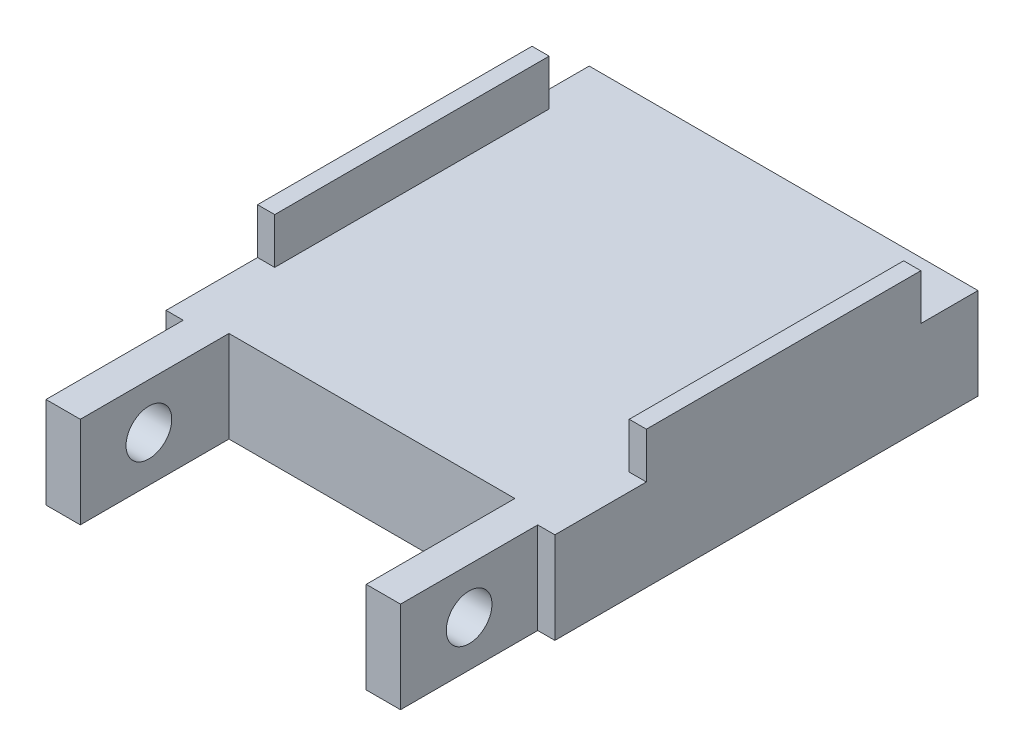
ISO-10303-21;
HEADER;
FILE_DESCRIPTION(('STEP AP214'),'2;1');
FILE_NAME('part.step','',(''),(''),'','','');
FILE_SCHEMA(('AUTOMOTIVE_DESIGN { 1 0 10303 214 1 1 1 1 }'));
ENDSEC;
DATA;
#1=APPLICATION_CONTEXT('core data for automotive mechanical design processes');
#2=APPLICATION_PROTOCOL_DEFINITION('international standard','automotive_design',2000,#1);
#3=PRODUCT_CONTEXT('',#1,'mechanical');
#4=PRODUCT('Part','Part','',(#3));
#5=PRODUCT_RELATED_PRODUCT_CATEGORY('part','',(#4));
#6=PRODUCT_DEFINITION_FORMATION('','',#4);
#7=PRODUCT_DEFINITION_CONTEXT('part definition',#1,'design');
#8=PRODUCT_DEFINITION('design','',#6,#7);
#9=PRODUCT_DEFINITION_SHAPE('','',#8);
#10=(LENGTH_UNIT() NAMED_UNIT(*) SI_UNIT(.MILLI.,.METRE.));
#11=(NAMED_UNIT(*) PLANE_ANGLE_UNIT() SI_UNIT($,.RADIAN.));
#12=(NAMED_UNIT(*) SI_UNIT($,.STERADIAN.) SOLID_ANGLE_UNIT());
#13=UNCERTAINTY_MEASURE_WITH_UNIT(LENGTH_MEASURE(1.E-05),#10,'distance_accuracy_value','');
#14=(GEOMETRIC_REPRESENTATION_CONTEXT(3) GLOBAL_UNCERTAINTY_ASSIGNED_CONTEXT((#13)) GLOBAL_UNIT_ASSIGNED_CONTEXT((#10,
#11,#12)) REPRESENTATION_CONTEXT('',''));
#15=CARTESIAN_POINT('',(0.,0.,0.));
#16=DIRECTION('',(0.,0.,1.));
#17=DIRECTION('',(1.,0.,0.));
#18=AXIS2_PLACEMENT_3D('',#15,#16,#17);
#19=CARTESIAN_POINT('',(17.,8.,24.5));
#20=DIRECTION('',(0.,0.,-1.));
#21=DIRECTION('',(-1.,0.,0.));
#22=AXIS2_PLACEMENT_3D('',#19,#20,#21);
#23=PLANE('',#22);
#24=DIRECTION('',(1.,0.,0.));
#25=VECTOR('',#24,1.);
#26=CARTESIAN_POINT('',(17.,8.,24.5));
#27=LINE('',#26,#25);
#28=CARTESIAN_POINT('',(-15.5,8.,24.5));
#29=VERTEX_POINT('',#28);
#30=CARTESIAN_POINT('',(-12.5,8.,24.5));
#31=VERTEX_POINT('',#30);
#32=EDGE_CURVE('E193',#29,#31,#27,.T.);
#33=ORIENTED_EDGE('',*,*,#32,.F.);
#34=DIRECTION('',(0.,1.,0.));
#35=VECTOR('',#34,1.);
#36=CARTESIAN_POINT('',(-15.5,-28.1780056072107,24.5));
#37=LINE('',#36,#35);
#38=CARTESIAN_POINT('',(-15.5,0.,24.5));
#39=VERTEX_POINT('',#38);
#40=EDGE_CURVE('E175',#39,#29,#37,.T.);
#41=ORIENTED_EDGE('',*,*,#40,.F.);
#42=DIRECTION('',(1.,0.,0.));
#43=VECTOR('',#42,1.);
#44=CARTESIAN_POINT('',(17.,0.,24.5));
#45=LINE('',#44,#43);
#46=CARTESIAN_POINT('',(-12.5,0.,24.5));
#47=VERTEX_POINT('',#46);
#48=EDGE_CURVE('E226',#39,#47,#45,.T.);
#49=ORIENTED_EDGE('',*,*,#48,.T.);
#50=DIRECTION('',(0.,1.,0.));
#51=VECTOR('',#50,1.);
#52=CARTESIAN_POINT('',(-12.5,-28.1780056072107,24.5));
#53=LINE('',#52,#51);
#54=EDGE_CURVE('E199',#47,#31,#53,.T.);
#55=ORIENTED_EDGE('',*,*,#54,.T.);
#56=EDGE_LOOP('',(#33,#41,#49,#55));
#57=FACE_BOUND('',#56,.T.);
#58=ADVANCED_FACE('F39',(#57),#23,.F.);
#59=CARTESIAN_POINT('',(0.,8.,0.));
#60=DIRECTION('',(0.,1.,0.));
#61=DIRECTION('',(0.,0.,1.));
#62=AXIS2_PLACEMENT_3D('',#59,#60,#61);
#63=PLANE('',#62);
#64=DIRECTION('',(0.,0.,1.));
#65=VECTOR('',#64,1.);
#66=CARTESIAN_POINT('',(-12.5,8.,24.5));
#67=LINE('',#66,#65);
#68=CARTESIAN_POINT('',(-12.5,8.,11.5));
#69=VERTEX_POINT('',#68);
#70=EDGE_CURVE('E298',#69,#31,#67,.T.);
#71=ORIENTED_EDGE('',*,*,#70,.F.);
#72=DIRECTION('',(-1.,0.,0.));
#73=VECTOR('',#72,1.);
#74=CARTESIAN_POINT('',(-12.5,8.,11.5));
#75=LINE('',#74,#73);
#76=CARTESIAN_POINT('',(12.5,8.,11.5));
#77=VERTEX_POINT('',#76);
#78=EDGE_CURVE('E306',#77,#69,#75,.T.);
#79=ORIENTED_EDGE('',*,*,#78,.F.);
#80=DIRECTION('',(0.,0.,-1.));
#81=VECTOR('',#80,1.);
#82=CARTESIAN_POINT('',(12.5,8.,24.5));
#83=LINE('',#82,#81);
#84=CARTESIAN_POINT('',(12.5,8.,24.5));
#85=VERTEX_POINT('',#84);
#86=EDGE_CURVE('E301',#85,#77,#83,.T.);
#87=ORIENTED_EDGE('',*,*,#86,.F.);
#88=CARTESIAN_POINT('',(15.5,8.,24.5));
#89=VERTEX_POINT('',#88);
#90=EDGE_CURVE('E202',#85,#89,#27,.T.);
#91=ORIENTED_EDGE('',*,*,#90,.T.);
#92=DIRECTION('',(0.,0.,1.));
#93=VECTOR('',#92,1.);
#94=CARTESIAN_POINT('',(15.5,8.,24.5));
#95=LINE('',#94,#93);
#96=CARTESIAN_POINT('',(15.5,8.,12.5));
#97=VERTEX_POINT('',#96);
#98=EDGE_CURVE('E275',#97,#89,#95,.T.);
#99=ORIENTED_EDGE('',*,*,#98,.F.);
#100=DIRECTION('',(-1.,0.,0.));
#101=VECTOR('',#100,1.);
#102=CARTESIAN_POINT('',(17.,8.,12.5));
#103=LINE('',#102,#101);
#104=CARTESIAN_POINT('',(17.,8.,12.5));
#105=VERTEX_POINT('',#104);
#106=EDGE_CURVE('E272',#105,#97,#103,.T.);
#107=ORIENTED_EDGE('',*,*,#106,.F.);
#108=DIRECTION('',(0.,0.,-1.));
#109=VECTOR('',#108,1.);
#110=CARTESIAN_POINT('',(17.,8.,24.5));
#111=LINE('',#110,#109);
#112=CARTESIAN_POINT('',(17.,8.,4.5));
#113=VERTEX_POINT('',#112);
#114=EDGE_CURVE('E206',#105,#113,#111,.T.);
#115=ORIENTED_EDGE('',*,*,#114,.T.);
#116=DIRECTION('',(1.,0.,0.));
#117=VECTOR('',#116,1.);
#118=CARTESIAN_POINT('',(17.,8.,4.5));
#119=LINE('',#118,#117);
#120=CARTESIAN_POINT('',(15.5,8.,4.5));
#121=VERTEX_POINT('',#120);
#122=EDGE_CURVE('E325',#121,#113,#119,.T.);
#123=ORIENTED_EDGE('',*,*,#122,.F.);
#124=DIRECTION('',(0.,0.,1.));
#125=VECTOR('',#124,1.);
#126=CARTESIAN_POINT('',(15.5,8.,-19.5));
#127=LINE('',#126,#125);
#128=CARTESIAN_POINT('',(15.5,8.,-19.5));
#129=VERTEX_POINT('',#128);
#130=EDGE_CURVE('E256',#129,#121,#127,.T.);
#131=ORIENTED_EDGE('',*,*,#130,.F.);
#132=DIRECTION('',(-1.,0.,0.));
#133=VECTOR('',#132,1.);
#134=CARTESIAN_POINT('',(17.,8.,-19.5));
#135=LINE('',#134,#133);
#136=CARTESIAN_POINT('',(17.,8.,-19.5));
#137=VERTEX_POINT('',#136);
#138=EDGE_CURVE('E252',#137,#129,#135,.T.);
#139=ORIENTED_EDGE('',*,*,#138,.F.);
#140=CARTESIAN_POINT('',(17.,8.,-24.5));
#141=VERTEX_POINT('',#140);
#142=EDGE_CURVE('E201',#137,#141,#111,.T.);
#143=ORIENTED_EDGE('',*,*,#142,.T.);
#144=DIRECTION('',(-1.,0.,0.));
#145=VECTOR('',#144,1.);
#146=CARTESIAN_POINT('',(17.,8.,-24.5));
#147=LINE('',#146,#145);
#148=CARTESIAN_POINT('',(-17.,8.,-24.5));
#149=VERTEX_POINT('',#148);
#150=EDGE_CURVE('E214',#141,#149,#147,.T.);
#151=ORIENTED_EDGE('',*,*,#150,.T.);
#152=DIRECTION('',(0.,0.,1.));
#153=VECTOR('',#152,1.);
#154=CARTESIAN_POINT('',(-17.,8.,24.5));
#155=LINE('',#154,#153);
#156=CARTESIAN_POINT('',(-17.,8.,-19.5));
#157=VERTEX_POINT('',#156);
#158=EDGE_CURVE('E209',#149,#157,#155,.T.);
#159=ORIENTED_EDGE('',*,*,#158,.T.);
#160=DIRECTION('',(-1.,0.,0.));
#161=VECTOR('',#160,1.);
#162=CARTESIAN_POINT('',(-17.,8.,-19.5));
#163=LINE('',#162,#161);
#164=CARTESIAN_POINT('',(-15.5,8.,-19.5));
#165=VERTEX_POINT('',#164);
#166=EDGE_CURVE('E360',#165,#157,#163,.T.);
#167=ORIENTED_EDGE('',*,*,#166,.F.);
#168=DIRECTION('',(0.,0.,-1.));
#169=VECTOR('',#168,1.);
#170=CARTESIAN_POINT('',(-15.5,8.,-19.5));
#171=LINE('',#170,#169);
#172=CARTESIAN_POINT('',(-15.5,8.,4.5));
#173=VERTEX_POINT('',#172);
#174=EDGE_CURVE('E373',#173,#165,#171,.T.);
#175=ORIENTED_EDGE('',*,*,#174,.F.);
#176=DIRECTION('',(1.,0.,0.));
#177=VECTOR('',#176,1.);
#178=CARTESIAN_POINT('',(-17.,8.,4.5));
#179=LINE('',#178,#177);
#180=CARTESIAN_POINT('',(-17.,8.,4.5));
#181=VERTEX_POINT('',#180);
#182=EDGE_CURVE('E354',#181,#173,#179,.T.);
#183=ORIENTED_EDGE('',*,*,#182,.F.);
#184=CARTESIAN_POINT('',(-17.,8.,12.5));
#185=VERTEX_POINT('',#184);
#186=EDGE_CURVE('E232',#181,#185,#155,.T.);
#187=ORIENTED_EDGE('',*,*,#186,.T.);
#188=DIRECTION('',(-1.,0.,0.));
#189=VECTOR('',#188,1.);
#190=CARTESIAN_POINT('',(-17.,8.,12.5));
#191=LINE('',#190,#189);
#192=CARTESIAN_POINT('',(-15.5,8.,12.5));
#193=VERTEX_POINT('',#192);
#194=EDGE_CURVE('E187',#193,#185,#191,.T.);
#195=ORIENTED_EDGE('',*,*,#194,.F.);
#196=DIRECTION('',(0.,0.,-1.));
#197=VECTOR('',#196,1.);
#198=CARTESIAN_POINT('',(-15.5,8.,24.5));
#199=LINE('',#198,#197);
#200=EDGE_CURVE('E178',#29,#193,#199,.T.);
#201=ORIENTED_EDGE('',*,*,#200,.F.);
#202=ORIENTED_EDGE('',*,*,#32,.T.);
#203=EDGE_LOOP('',(#71,#79,#87,#91,#99,#107,#115,#123,#131,#139,#143,#151,#159,#167,#175,#183,
#187,#195,#201,#202));
#204=FACE_BOUND('',#203,.T.);
#205=ADVANCED_FACE('F192',(#204),#63,.T.);
#206=CARTESIAN_POINT('',(-17.,8.,24.5));
#207=DIRECTION('',(1.,0.,0.));
#208=DIRECTION('',(0.,0.,-1.));
#209=AXIS2_PLACEMENT_3D('',#206,#207,#208);
#210=PLANE('',#209);
#211=DIRECTION('',(0.,0.,1.));
#212=VECTOR('',#211,1.);
#213=CARTESIAN_POINT('',(-17.,0.,24.5));
#214=LINE('',#213,#212);
#215=CARTESIAN_POINT('',(-17.,0.,-24.5));
#216=VERTEX_POINT('',#215);
#217=CARTESIAN_POINT('',(-17.,0.,12.5));
#218=VERTEX_POINT('',#217);
#219=EDGE_CURVE('E217',#216,#218,#214,.T.);
#220=ORIENTED_EDGE('',*,*,#219,.T.);
#221=DIRECTION('',(0.,1.,0.));
#222=VECTOR('',#221,1.);
#223=CARTESIAN_POINT('',(-17.,-28.1780056072107,12.5));
#224=LINE('',#223,#222);
#225=EDGE_CURVE('E258',#218,#185,#224,.T.);
#226=ORIENTED_EDGE('',*,*,#225,.T.);
#227=ORIENTED_EDGE('',*,*,#186,.F.);
#228=DIRECTION('',(0.,-1.,0.));
#229=VECTOR('',#228,1.);
#230=CARTESIAN_POINT('',(-17.,12.,4.5));
#231=LINE('',#230,#229);
#232=CARTESIAN_POINT('',(-17.,12.,4.5));
#233=VERTEX_POINT('',#232);
#234=EDGE_CURVE('E222',#233,#181,#231,.T.);
#235=ORIENTED_EDGE('',*,*,#234,.F.);
#236=DIRECTION('',(0.,0.,1.));
#237=VECTOR('',#236,1.);
#238=CARTESIAN_POINT('',(-17.,12.,-19.5));
#239=LINE('',#238,#237);
#240=CARTESIAN_POINT('',(-17.,12.,-19.5));
#241=VERTEX_POINT('',#240);
#242=EDGE_CURVE('E355',#241,#233,#239,.T.);
#243=ORIENTED_EDGE('',*,*,#242,.F.);
#244=DIRECTION('',(0.,-1.,0.));
#245=VECTOR('',#244,1.);
#246=CARTESIAN_POINT('',(-17.,12.,-19.5));
#247=LINE('',#246,#245);
#248=EDGE_CURVE('E369',#241,#157,#247,.T.);
#249=ORIENTED_EDGE('',*,*,#248,.T.);
#250=ORIENTED_EDGE('',*,*,#158,.F.);
#251=DIRECTION('',(0.,-1.,0.));
#252=VECTOR('',#251,1.);
#253=CARTESIAN_POINT('',(-17.,8.,-24.5));
#254=LINE('',#253,#252);
#255=EDGE_CURVE('E48',#149,#216,#254,.T.);
#256=ORIENTED_EDGE('',*,*,#255,.T.);
#257=EDGE_LOOP('',(#220,#226,#227,#235,#243,#249,#250,#256));
#258=FACE_BOUND('',#257,.T.);
#259=ADVANCED_FACE('F41',(#258),#210,.F.);
#260=CARTESIAN_POINT('',(12.5,0.,24.5));
#261=VERTEX_POINT('',#260);
#262=CARTESIAN_POINT('',(15.5,0.,24.5));
#263=VERTEX_POINT('',#262);
#264=EDGE_CURVE('E221',#261,#263,#45,.T.);
#265=ORIENTED_EDGE('',*,*,#264,.T.);
#266=DIRECTION('',(0.,1.,0.));
#267=VECTOR('',#266,1.);
#268=CARTESIAN_POINT('',(15.5,-28.1780056072107,24.5));
#269=LINE('',#268,#267);
#270=EDGE_CURVE('E271',#263,#89,#269,.T.);
#271=ORIENTED_EDGE('',*,*,#270,.T.);
#272=ORIENTED_EDGE('',*,*,#90,.F.);
#273=DIRECTION('',(0.,1.,0.));
#274=VECTOR('',#273,1.);
#275=CARTESIAN_POINT('',(12.5,-28.1780056072107,24.5));
#276=LINE('',#275,#274);
#277=EDGE_CURVE('E315',#261,#85,#276,.T.);
#278=ORIENTED_EDGE('',*,*,#277,.F.);
#279=EDGE_LOOP('',(#265,#271,#272,#278));
#280=FACE_BOUND('',#279,.T.);
#281=ADVANCED_FACE('F421',(#280),#23,.F.);
#282=CARTESIAN_POINT('',(17.,8.,24.5));
#283=DIRECTION('',(-1.,0.,0.));
#284=DIRECTION('',(0.,0.,1.));
#285=AXIS2_PLACEMENT_3D('',#282,#283,#284);
#286=PLANE('',#285);
#287=ORIENTED_EDGE('',*,*,#114,.F.);
#288=DIRECTION('',(0.,1.,0.));
#289=VECTOR('',#288,1.);
#290=CARTESIAN_POINT('',(17.,-28.1780056072107,12.5));
#291=LINE('',#290,#289);
#292=CARTESIAN_POINT('',(17.,0.,12.5));
#293=VERTEX_POINT('',#292);
#294=EDGE_CURVE('E279',#293,#105,#291,.T.);
#295=ORIENTED_EDGE('',*,*,#294,.F.);
#296=DIRECTION('',(0.,0.,-1.));
#297=VECTOR('',#296,1.);
#298=CARTESIAN_POINT('',(17.,0.,24.5));
#299=LINE('',#298,#297);
#300=CARTESIAN_POINT('',(17.,0.,-24.5));
#301=VERTEX_POINT('',#300);
#302=EDGE_CURVE('E227',#293,#301,#299,.T.);
#303=ORIENTED_EDGE('',*,*,#302,.T.);
#304=DIRECTION('',(0.,-1.,0.));
#305=VECTOR('',#304,1.);
#306=CARTESIAN_POINT('',(17.,8.,-24.5));
#307=LINE('',#306,#305);
#308=EDGE_CURVE('E11',#141,#301,#307,.T.);
#309=ORIENTED_EDGE('',*,*,#308,.F.);
#310=ORIENTED_EDGE('',*,*,#142,.F.);
#311=DIRECTION('',(0.,-1.,0.));
#312=VECTOR('',#311,1.);
#313=CARTESIAN_POINT('',(17.,12.,-19.5));
#314=LINE('',#313,#312);
#315=CARTESIAN_POINT('',(17.,12.,-19.5));
#316=VERTEX_POINT('',#315);
#317=EDGE_CURVE('E351',#316,#137,#314,.T.);
#318=ORIENTED_EDGE('',*,*,#317,.F.);
#319=DIRECTION('',(0.,0.,-1.));
#320=VECTOR('',#319,1.);
#321=CARTESIAN_POINT('',(17.,12.,-19.5));
#322=LINE('',#321,#320);
#323=CARTESIAN_POINT('',(17.,12.,4.5));
#324=VERTEX_POINT('',#323);
#325=EDGE_CURVE('E320',#324,#316,#322,.T.);
#326=ORIENTED_EDGE('',*,*,#325,.F.);
#327=DIRECTION('',(0.,-1.,0.));
#328=VECTOR('',#327,1.);
#329=CARTESIAN_POINT('',(17.,12.,4.5));
#330=LINE('',#329,#328);
#331=EDGE_CURVE('E333',#324,#113,#330,.T.);
#332=ORIENTED_EDGE('',*,*,#331,.T.);
#333=EDGE_LOOP('',(#287,#295,#303,#309,#310,#318,#326,#332));
#334=FACE_BOUND('',#333,.T.);
#335=ADVANCED_FACE('F428',(#334),#286,.F.);
#336=CARTESIAN_POINT('',(17.,8.,-24.5));
#337=DIRECTION('',(0.,0.,1.));
#338=DIRECTION('',(1.,0.,0.));
#339=AXIS2_PLACEMENT_3D('',#336,#337,#338);
#340=PLANE('',#339);
#341=DIRECTION('',(-1.,0.,0.));
#342=VECTOR('',#341,1.);
#343=CARTESIAN_POINT('',(17.,0.,-24.5));
#344=LINE('',#343,#342);
#345=EDGE_CURVE('E230',#301,#216,#344,.T.);
#346=ORIENTED_EDGE('',*,*,#345,.T.);
#347=ORIENTED_EDGE('',*,*,#255,.F.);
#348=ORIENTED_EDGE('',*,*,#150,.F.);
#349=ORIENTED_EDGE('',*,*,#308,.T.);
#350=EDGE_LOOP('',(#346,#347,#348,#349));
#351=FACE_BOUND('',#350,.T.);
#352=ADVANCED_FACE('F434',(#351),#340,.F.);
#353=CARTESIAN_POINT('',(0.,0.,0.));
#354=DIRECTION('',(0.,1.,0.));
#355=DIRECTION('',(0.,0.,1.));
#356=AXIS2_PLACEMENT_3D('',#353,#354,#355);
#357=PLANE('',#356);
#358=CARTESIAN_POINT('',(4.99999999999999,0.,-9.49999999999999));
#359=DIRECTION('',(0.,-1.,0.));
#360=DIRECTION('',(0.,0.,-1.));
#361=AXIS2_PLACEMENT_3D('',#358,#359,#360);
#362=CIRCLE('',#361,0.500000000000002);
#363=CARTESIAN_POINT('',(4.99999999999999,0.,-10.));
#364=VERTEX_POINT('',#363);
#365=EDGE_CURVE('E816',#364,#364,#362,.T.);
#366=ORIENTED_EDGE('',*,*,#365,.F.);
#367=EDGE_LOOP('',(#366));
#368=FACE_BOUND('',#367,.T.);
#369=CARTESIAN_POINT('',(11.,0.,-9.49999999999999));
#370=DIRECTION('',(0.,-1.,0.));
#371=DIRECTION('',(0.,0.,-1.));
#372=AXIS2_PLACEMENT_3D('',#369,#370,#371);
#373=CIRCLE('',#372,0.500000000000001);
#374=CARTESIAN_POINT('',(11.,0.,-9.99999999999999));
#375=VERTEX_POINT('',#374);
#376=EDGE_CURVE('E833',#375,#375,#373,.T.);
#377=ORIENTED_EDGE('',*,*,#376,.F.);
#378=EDGE_LOOP('',(#377));
#379=FACE_BOUND('',#378,.T.);
#380=CARTESIAN_POINT('',(-4.50000000000001,0.,-9.49999999999999));
#381=DIRECTION('',(0.,-1.,0.));
#382=DIRECTION('',(0.,0.,-1.));
#383=AXIS2_PLACEMENT_3D('',#380,#381,#382);
#384=CIRCLE('',#383,0.5);
#385=CARTESIAN_POINT('',(-4.50000000000001,0.,-9.99999999999999));
#386=VERTEX_POINT('',#385);
#387=EDGE_CURVE('E841',#386,#386,#384,.T.);
#388=ORIENTED_EDGE('',*,*,#387,.F.);
#389=EDGE_LOOP('',(#388));
#390=FACE_BOUND('',#389,.T.);
#391=CARTESIAN_POINT('',(-10.5,0.,-9.49999999999999));
#392=DIRECTION('',(0.,-1.,0.));
#393=DIRECTION('',(0.,0.,-1.));
#394=AXIS2_PLACEMENT_3D('',#391,#392,#393);
#395=CIRCLE('',#394,0.500000000000001);
#396=CARTESIAN_POINT('',(-10.5,0.,-9.99999999999999));
#397=VERTEX_POINT('',#396);
#398=EDGE_CURVE('E849',#397,#397,#395,.T.);
#399=ORIENTED_EDGE('',*,*,#398,.F.);
#400=EDGE_LOOP('',(#399));
#401=FACE_BOUND('',#400,.T.);
#402=CARTESIAN_POINT('',(0.,0.,-14.));
#403=DIRECTION('',(0.,-1.,0.));
#404=DIRECTION('',(0.,0.,-1.));
#405=AXIS2_PLACEMENT_3D('',#402,#403,#404);
#406=CIRCLE('',#405,0.500000000000001);
#407=CARTESIAN_POINT('',(0.,0.,-14.5));
#408=VERTEX_POINT('',#407);
#409=EDGE_CURVE('E883',#408,#408,#406,.T.);
#410=ORIENTED_EDGE('',*,*,#409,.F.);
#411=EDGE_LOOP('',(#410));
#412=FACE_BOUND('',#411,.T.);
#413=CARTESIAN_POINT('',(0.,0.,-5.));
#414=DIRECTION('',(0.,-1.,0.));
#415=DIRECTION('',(0.,0.,-1.));
#416=AXIS2_PLACEMENT_3D('',#413,#414,#415);
#417=CIRCLE('',#416,0.5);
#418=CARTESIAN_POINT('',(0.,0.,-5.5));
#419=VERTEX_POINT('',#418);
#420=EDGE_CURVE('E827',#419,#419,#417,.T.);
#421=ORIENTED_EDGE('',*,*,#420,.F.);
#422=EDGE_LOOP('',(#421));
#423=FACE_BOUND('',#422,.T.);
#424=CARTESIAN_POINT('',(0.,0.,-9.5));
#425=DIRECTION('',(0.,-1.,0.));
#426=DIRECTION('',(0.,0.,-1.));
#427=AXIS2_PLACEMENT_3D('',#424,#425,#426);
#428=CIRCLE('',#427,1.5);
#429=CARTESIAN_POINT('',(0.,0.,-11.));
#430=VERTEX_POINT('',#429);
#431=EDGE_CURVE('E815',#430,#430,#428,.T.);
#432=ORIENTED_EDGE('',*,*,#431,.F.);
#433=EDGE_LOOP('',(#432));
#434=FACE_BOUND('',#433,.T.);
#435=DIRECTION('',(0.,0.,1.));
#436=VECTOR('',#435,1.);
#437=CARTESIAN_POINT('',(12.5,0.,24.5));
#438=LINE('',#437,#436);
#439=CARTESIAN_POINT('',(12.5,0.,11.5));
#440=VERTEX_POINT('',#439);
#441=EDGE_CURVE('E289',#440,#261,#438,.T.);
#442=ORIENTED_EDGE('',*,*,#441,.F.);
#443=DIRECTION('',(1.,0.,0.));
#444=VECTOR('',#443,1.);
#445=CARTESIAN_POINT('',(-12.5,0.,11.5));
#446=LINE('',#445,#444);
#447=CARTESIAN_POINT('',(-12.5,0.,11.5));
#448=VERTEX_POINT('',#447);
#449=EDGE_CURVE('E292',#448,#440,#446,.T.);
#450=ORIENTED_EDGE('',*,*,#449,.F.);
#451=DIRECTION('',(0.,0.,-1.));
#452=VECTOR('',#451,1.);
#453=CARTESIAN_POINT('',(-12.5,0.,24.5));
#454=LINE('',#453,#452);
#455=EDGE_CURVE('E276',#47,#448,#454,.T.);
#456=ORIENTED_EDGE('',*,*,#455,.F.);
#457=ORIENTED_EDGE('',*,*,#48,.F.);
#458=DIRECTION('',(0.,0.,1.));
#459=VECTOR('',#458,1.);
#460=CARTESIAN_POINT('',(-15.5,0.,24.5));
#461=LINE('',#460,#459);
#462=CARTESIAN_POINT('',(-15.5,0.,12.5));
#463=VERTEX_POINT('',#462);
#464=EDGE_CURVE('E181',#463,#39,#461,.T.);
#465=ORIENTED_EDGE('',*,*,#464,.F.);
#466=DIRECTION('',(1.,0.,0.));
#467=VECTOR('',#466,1.);
#468=CARTESIAN_POINT('',(-17.,0.,12.5));
#469=LINE('',#468,#467);
#470=EDGE_CURVE('E249',#218,#463,#469,.T.);
#471=ORIENTED_EDGE('',*,*,#470,.F.);
#472=ORIENTED_EDGE('',*,*,#219,.F.);
#473=ORIENTED_EDGE('',*,*,#345,.F.);
#474=ORIENTED_EDGE('',*,*,#302,.F.);
#475=DIRECTION('',(1.,0.,0.));
#476=VECTOR('',#475,1.);
#477=CARTESIAN_POINT('',(17.,0.,12.5));
#478=LINE('',#477,#476);
#479=CARTESIAN_POINT('',(15.5,0.,12.5));
#480=VERTEX_POINT('',#479);
#481=EDGE_CURVE('E196',#480,#293,#478,.T.);
#482=ORIENTED_EDGE('',*,*,#481,.F.);
#483=DIRECTION('',(0.,0.,-1.));
#484=VECTOR('',#483,1.);
#485=CARTESIAN_POINT('',(15.5,0.,24.5));
#486=LINE('',#485,#484);
#487=EDGE_CURVE('E268',#263,#480,#486,.T.);
#488=ORIENTED_EDGE('',*,*,#487,.F.);
#489=ORIENTED_EDGE('',*,*,#264,.F.);
#490=EDGE_LOOP('',(#442,#450,#456,#457,#465,#471,#472,#473,#474,#482,#488,#489));
#491=FACE_BOUND('',#490,.T.);
#492=ADVANCED_FACE('F247',(#368,#379,#390,#401,#412,#423,#434,#491),#357,.F.);
#493=CARTESIAN_POINT('',(-17.,12.,4.5));
#494=DIRECTION('',(0.,0.,-1.));
#495=DIRECTION('',(-1.,0.,0.));
#496=AXIS2_PLACEMENT_3D('',#493,#494,#495);
#497=PLANE('',#496);
#498=ORIENTED_EDGE('',*,*,#182,.T.);
#499=DIRECTION('',(0.,-1.,0.));
#500=VECTOR('',#499,1.);
#501=CARTESIAN_POINT('',(-15.5,12.,4.5));
#502=LINE('',#501,#500);
#503=CARTESIAN_POINT('',(-15.5,12.,4.5));
#504=VERTEX_POINT('',#503);
#505=EDGE_CURVE('E386',#504,#173,#502,.T.);
#506=ORIENTED_EDGE('',*,*,#505,.F.);
#507=DIRECTION('',(1.,0.,0.));
#508=VECTOR('',#507,1.);
#509=CARTESIAN_POINT('',(-17.,12.,4.5));
#510=LINE('',#509,#508);
#511=EDGE_CURVE('E359',#233,#504,#510,.T.);
#512=ORIENTED_EDGE('',*,*,#511,.F.);
#513=ORIENTED_EDGE('',*,*,#234,.T.);
#514=EDGE_LOOP('',(#498,#506,#512,#513));
#515=FACE_BOUND('',#514,.T.);
#516=ADVANCED_FACE('F393',(#515),#497,.F.);
#517=CARTESIAN_POINT('',(-15.5,12.,-19.5));
#518=DIRECTION('',(-1.,0.,0.));
#519=DIRECTION('',(0.,0.,1.));
#520=AXIS2_PLACEMENT_3D('',#517,#518,#519);
#521=PLANE('',#520);
#522=ORIENTED_EDGE('',*,*,#174,.T.);
#523=DIRECTION('',(0.,-1.,0.));
#524=VECTOR('',#523,1.);
#525=CARTESIAN_POINT('',(-15.5,12.,-19.5));
#526=LINE('',#525,#524);
#527=CARTESIAN_POINT('',(-15.5,12.,-19.5));
#528=VERTEX_POINT('',#527);
#529=EDGE_CURVE('E382',#528,#165,#526,.T.);
#530=ORIENTED_EDGE('',*,*,#529,.F.);
#531=DIRECTION('',(0.,0.,-1.));
#532=VECTOR('',#531,1.);
#533=CARTESIAN_POINT('',(-15.5,12.,-19.5));
#534=LINE('',#533,#532);
#535=EDGE_CURVE('E363',#504,#528,#534,.T.);
#536=ORIENTED_EDGE('',*,*,#535,.F.);
#537=ORIENTED_EDGE('',*,*,#505,.T.);
#538=EDGE_LOOP('',(#522,#530,#536,#537));
#539=FACE_BOUND('',#538,.T.);
#540=ADVANCED_FACE('F406',(#539),#521,.F.);
#541=CARTESIAN_POINT('',(-17.,12.,-19.5));
#542=DIRECTION('',(0.,0.,1.));
#543=DIRECTION('',(1.,0.,0.));
#544=AXIS2_PLACEMENT_3D('',#541,#542,#543);
#545=PLANE('',#544);
#546=ORIENTED_EDGE('',*,*,#166,.T.);
#547=ORIENTED_EDGE('',*,*,#248,.F.);
#548=DIRECTION('',(-1.,0.,0.));
#549=VECTOR('',#548,1.);
#550=CARTESIAN_POINT('',(-17.,12.,-19.5));
#551=LINE('',#550,#549);
#552=EDGE_CURVE('E366',#528,#241,#551,.T.);
#553=ORIENTED_EDGE('',*,*,#552,.F.);
#554=ORIENTED_EDGE('',*,*,#529,.T.);
#555=EDGE_LOOP('',(#546,#547,#553,#554));
#556=FACE_BOUND('',#555,.T.);
#557=ADVANCED_FACE('F401',(#556),#545,.F.);
#558=CARTESIAN_POINT('',(0.,12.,0.));
#559=DIRECTION('',(0.,1.,0.));
#560=DIRECTION('',(0.,0.,1.));
#561=AXIS2_PLACEMENT_3D('',#558,#559,#560);
#562=PLANE('',#561);
#563=ORIENTED_EDGE('',*,*,#242,.T.);
#564=ORIENTED_EDGE('',*,*,#511,.T.);
#565=ORIENTED_EDGE('',*,*,#535,.T.);
#566=ORIENTED_EDGE('',*,*,#552,.T.);
#567=EDGE_LOOP('',(#563,#564,#565,#566));
#568=FACE_BOUND('',#567,.T.);
#569=ADVANCED_FACE('F408',(#568),#562,.T.);
#570=CARTESIAN_POINT('',(17.,12.,-19.5));
#571=DIRECTION('',(0.,0.,1.));
#572=DIRECTION('',(1.,0.,0.));
#573=AXIS2_PLACEMENT_3D('',#570,#571,#572);
#574=PLANE('',#573);
#575=ORIENTED_EDGE('',*,*,#138,.T.);
#576=DIRECTION('',(0.,-1.,0.));
#577=VECTOR('',#576,1.);
#578=CARTESIAN_POINT('',(15.5,12.,-19.5));
#579=LINE('',#578,#577);
#580=CARTESIAN_POINT('',(15.5,12.,-19.5));
#581=VERTEX_POINT('',#580);
#582=EDGE_CURVE('E347',#581,#129,#579,.T.);
#583=ORIENTED_EDGE('',*,*,#582,.F.);
#584=DIRECTION('',(-1.,0.,0.));
#585=VECTOR('',#584,1.);
#586=CARTESIAN_POINT('',(17.,12.,-19.5));
#587=LINE('',#586,#585);
#588=EDGE_CURVE('E324',#316,#581,#587,.T.);
#589=ORIENTED_EDGE('',*,*,#588,.F.);
#590=ORIENTED_EDGE('',*,*,#317,.T.);
#591=EDGE_LOOP('',(#575,#583,#589,#590));
#592=FACE_BOUND('',#591,.T.);
#593=ADVANCED_FACE('F410',(#592),#574,.F.);
#594=CARTESIAN_POINT('',(15.5,12.,-19.5));
#595=DIRECTION('',(1.,0.,0.));
#596=DIRECTION('',(0.,0.,-1.));
#597=AXIS2_PLACEMENT_3D('',#594,#595,#596);
#598=PLANE('',#597);
#599=ORIENTED_EDGE('',*,*,#130,.T.);
#600=DIRECTION('',(0.,-1.,0.));
#601=VECTOR('',#600,1.);
#602=CARTESIAN_POINT('',(15.5,12.,4.5));
#603=LINE('',#602,#601);
#604=CARTESIAN_POINT('',(15.5,12.,4.5));
#605=VERTEX_POINT('',#604);
#606=EDGE_CURVE('E344',#605,#121,#603,.T.);
#607=ORIENTED_EDGE('',*,*,#606,.F.);
#608=DIRECTION('',(0.,0.,1.));
#609=VECTOR('',#608,1.);
#610=CARTESIAN_POINT('',(15.5,12.,-19.5));
#611=LINE('',#610,#609);
#612=EDGE_CURVE('E328',#581,#605,#611,.T.);
#613=ORIENTED_EDGE('',*,*,#612,.F.);
#614=ORIENTED_EDGE('',*,*,#582,.T.);
#615=EDGE_LOOP('',(#599,#607,#613,#614));
#616=FACE_BOUND('',#615,.T.);
#617=ADVANCED_FACE('F416',(#616),#598,.F.);
#618=CARTESIAN_POINT('',(17.,12.,4.5));
#619=DIRECTION('',(0.,0.,-1.));
#620=DIRECTION('',(-1.,0.,0.));
#621=AXIS2_PLACEMENT_3D('',#618,#619,#620);
#622=PLANE('',#621);
#623=ORIENTED_EDGE('',*,*,#122,.T.);
#624=ORIENTED_EDGE('',*,*,#331,.F.);
#625=DIRECTION('',(1.,0.,0.));
#626=VECTOR('',#625,1.);
#627=CARTESIAN_POINT('',(17.,12.,4.5));
#628=LINE('',#627,#626);
#629=EDGE_CURVE('E331',#605,#324,#628,.T.);
#630=ORIENTED_EDGE('',*,*,#629,.F.);
#631=ORIENTED_EDGE('',*,*,#606,.T.);
#632=EDGE_LOOP('',(#623,#624,#630,#631));
#633=FACE_BOUND('',#632,.T.);
#634=ADVANCED_FACE('F468',(#633),#622,.F.);
#635=CARTESIAN_POINT('',(0.,12.,0.));
#636=DIRECTION('',(0.,-1.,0.));
#637=DIRECTION('',(0.,0.,-1.));
#638=AXIS2_PLACEMENT_3D('',#635,#636,#637);
#639=PLANE('',#638);
#640=ORIENTED_EDGE('',*,*,#325,.T.);
#641=ORIENTED_EDGE('',*,*,#588,.T.);
#642=ORIENTED_EDGE('',*,*,#612,.T.);
#643=ORIENTED_EDGE('',*,*,#629,.T.);
#644=EDGE_LOOP('',(#640,#641,#642,#643));
#645=FACE_BOUND('',#644,.T.);
#646=ADVANCED_FACE('F460',(#645),#639,.F.);
#647=CARTESIAN_POINT('',(-12.5,-28.1780056072107,24.5));
#648=DIRECTION('',(-1.,0.,0.));
#649=DIRECTION('',(0.,0.,1.));
#650=AXIS2_PLACEMENT_3D('',#647,#648,#649);
#651=PLANE('',#650);
#652=CARTESIAN_POINT('',(-12.5,4.,18.5));
#653=DIRECTION('',(-1.,0.,0.));
#654=DIRECTION('',(0.,0.,1.));
#655=AXIS2_PLACEMENT_3D('',#652,#653,#654);
#656=CIRCLE('',#655,2.);
#657=CARTESIAN_POINT('',(-12.5,4.,20.5));
#658=VERTEX_POINT('',#657);
#659=EDGE_CURVE('E302',#658,#658,#656,.T.);
#660=ORIENTED_EDGE('',*,*,#659,.T.);
#661=EDGE_LOOP('',(#660));
#662=FACE_BOUND('',#661,.T.);
#663=ORIENTED_EDGE('',*,*,#455,.T.);
#664=DIRECTION('',(0.,1.,0.));
#665=VECTOR('',#664,1.);
#666=CARTESIAN_POINT('',(-12.5,-28.1780056072107,11.5));
#667=LINE('',#666,#665);
#668=EDGE_CURVE('E293',#448,#69,#667,.T.);
#669=ORIENTED_EDGE('',*,*,#668,.T.);
#670=ORIENTED_EDGE('',*,*,#70,.T.);
#671=ORIENTED_EDGE('',*,*,#54,.F.);
#672=EDGE_LOOP('',(#663,#669,#670,#671));
#673=FACE_BOUND('',#672,.T.);
#674=ADVANCED_FACE('F458',(#662,#673),#651,.F.);
#675=CARTESIAN_POINT('',(-12.5,-28.1780056072107,11.5));
#676=DIRECTION('',(0.,0.,-1.));
#677=DIRECTION('',(-1.,0.,0.));
#678=AXIS2_PLACEMENT_3D('',#675,#676,#677);
#679=PLANE('',#678);
#680=ORIENTED_EDGE('',*,*,#449,.T.);
#681=DIRECTION('',(0.,1.,0.));
#682=VECTOR('',#681,1.);
#683=CARTESIAN_POINT('',(12.5,-28.1780056072107,11.5));
#684=LINE('',#683,#682);
#685=EDGE_CURVE('E312',#440,#77,#684,.T.);
#686=ORIENTED_EDGE('',*,*,#685,.T.);
#687=ORIENTED_EDGE('',*,*,#78,.T.);
#688=ORIENTED_EDGE('',*,*,#668,.F.);
#689=EDGE_LOOP('',(#680,#686,#687,#688));
#690=FACE_BOUND('',#689,.T.);
#691=ADVANCED_FACE('F453',(#690),#679,.F.);
#692=CARTESIAN_POINT('',(12.5,-28.1780056072107,24.5));
#693=DIRECTION('',(1.,0.,0.));
#694=DIRECTION('',(0.,0.,-1.));
#695=AXIS2_PLACEMENT_3D('',#692,#693,#694);
#696=PLANE('',#695);
#697=CARTESIAN_POINT('',(12.5,4.,18.5));
#698=DIRECTION('',(1.,0.,0.));
#699=DIRECTION('',(0.,0.,-1.));
#700=AXIS2_PLACEMENT_3D('',#697,#698,#699);
#701=CIRCLE('',#700,2.);
#702=CARTESIAN_POINT('',(12.5,4.,16.5));
#703=VERTEX_POINT('',#702);
#704=EDGE_CURVE('E865',#703,#703,#701,.T.);
#705=ORIENTED_EDGE('',*,*,#704,.T.);
#706=EDGE_LOOP('',(#705));
#707=FACE_BOUND('',#706,.T.);
#708=ORIENTED_EDGE('',*,*,#441,.T.);
#709=ORIENTED_EDGE('',*,*,#277,.T.);
#710=ORIENTED_EDGE('',*,*,#86,.T.);
#711=ORIENTED_EDGE('',*,*,#685,.F.);
#712=EDGE_LOOP('',(#708,#709,#710,#711));
#713=FACE_BOUND('',#712,.T.);
#714=ADVANCED_FACE('F451',(#707,#713),#696,.F.);
#715=CARTESIAN_POINT('',(15.5,-28.1780056072107,24.5));
#716=DIRECTION('',(-1.,0.,0.));
#717=DIRECTION('',(0.,0.,1.));
#718=AXIS2_PLACEMENT_3D('',#715,#716,#717);
#719=PLANE('',#718);
#720=CARTESIAN_POINT('',(15.5,4.,18.5));
#721=DIRECTION('',(-1.,0.,0.));
#722=DIRECTION('',(0.,0.,1.));
#723=AXIS2_PLACEMENT_3D('',#720,#721,#722);
#724=CIRCLE('',#723,2.);
#725=CARTESIAN_POINT('',(15.5,4.,20.5));
#726=VERTEX_POINT('',#725);
#727=EDGE_CURVE('E861',#726,#726,#724,.F.);
#728=ORIENTED_EDGE('',*,*,#727,.F.);
#729=EDGE_LOOP('',(#728));
#730=FACE_BOUND('',#729,.T.);
#731=ORIENTED_EDGE('',*,*,#487,.T.);
#732=DIRECTION('',(0.,1.,0.));
#733=VECTOR('',#732,1.);
#734=CARTESIAN_POINT('',(15.5,-28.1780056072107,12.5));
#735=LINE('',#734,#733);
#736=EDGE_CURVE('E63',#480,#97,#735,.T.);
#737=ORIENTED_EDGE('',*,*,#736,.T.);
#738=ORIENTED_EDGE('',*,*,#98,.T.);
#739=ORIENTED_EDGE('',*,*,#270,.F.);
#740=EDGE_LOOP('',(#731,#737,#738,#739));
#741=FACE_BOUND('',#740,.T.);
#742=ADVANCED_FACE('F443',(#730,#741),#719,.F.);
#743=CARTESIAN_POINT('',(17.,-28.1780056072107,12.5));
#744=DIRECTION('',(0.,0.,-1.));
#745=DIRECTION('',(-1.,0.,0.));
#746=AXIS2_PLACEMENT_3D('',#743,#744,#745);
#747=PLANE('',#746);
#748=ORIENTED_EDGE('',*,*,#481,.T.);
#749=ORIENTED_EDGE('',*,*,#294,.T.);
#750=ORIENTED_EDGE('',*,*,#106,.T.);
#751=ORIENTED_EDGE('',*,*,#736,.F.);
#752=EDGE_LOOP('',(#748,#749,#750,#751));
#753=FACE_BOUND('',#752,.T.);
#754=ADVANCED_FACE('F569',(#753),#747,.F.);
#755=CARTESIAN_POINT('',(-17.,-28.1780056072107,12.5));
#756=DIRECTION('',(0.,0.,-1.));
#757=DIRECTION('',(-1.,0.,0.));
#758=AXIS2_PLACEMENT_3D('',#755,#756,#757);
#759=PLANE('',#758);
#760=ORIENTED_EDGE('',*,*,#470,.T.);
#761=DIRECTION('',(0.,1.,0.));
#762=VECTOR('',#761,1.);
#763=CARTESIAN_POINT('',(-15.5,-28.1780056072107,12.5));
#764=LINE('',#763,#762);
#765=EDGE_CURVE('E55',#463,#193,#764,.T.);
#766=ORIENTED_EDGE('',*,*,#765,.T.);
#767=ORIENTED_EDGE('',*,*,#194,.T.);
#768=ORIENTED_EDGE('',*,*,#225,.F.);
#769=EDGE_LOOP('',(#760,#766,#767,#768));
#770=FACE_BOUND('',#769,.T.);
#771=ADVANCED_FACE('F574',(#770),#759,.F.);
#772=CARTESIAN_POINT('',(-15.5,-28.1780056072107,24.5));
#773=DIRECTION('',(1.,0.,0.));
#774=DIRECTION('',(0.,0.,-1.));
#775=AXIS2_PLACEMENT_3D('',#772,#773,#774);
#776=PLANE('',#775);
#777=CARTESIAN_POINT('',(-15.5,4.,18.5));
#778=DIRECTION('',(-1.,0.,0.));
#779=DIRECTION('',(0.,0.,1.));
#780=AXIS2_PLACEMENT_3D('',#777,#778,#779);
#781=CIRCLE('',#780,2.);
#782=CARTESIAN_POINT('',(-15.5,4.,20.5));
#783=VERTEX_POINT('',#782);
#784=EDGE_CURVE('E856',#783,#783,#781,.T.);
#785=ORIENTED_EDGE('',*,*,#784,.F.);
#786=EDGE_LOOP('',(#785));
#787=FACE_BOUND('',#786,.T.);
#788=ORIENTED_EDGE('',*,*,#464,.T.);
#789=ORIENTED_EDGE('',*,*,#40,.T.);
#790=ORIENTED_EDGE('',*,*,#200,.T.);
#791=ORIENTED_EDGE('',*,*,#765,.F.);
#792=EDGE_LOOP('',(#788,#789,#790,#791));
#793=FACE_BOUND('',#792,.T.);
#794=ADVANCED_FACE('F177',(#787,#793),#776,.F.);
#795=CARTESIAN_POINT('',(21.1568542494924,4.,18.5));
#796=DIRECTION('',(-1.,0.,0.));
#797=DIRECTION('',(0.,0.,1.));
#798=AXIS2_PLACEMENT_3D('',#795,#796,#797);
#799=CYLINDRICAL_SURFACE('',#798,2.);
#800=ORIENTED_EDGE('',*,*,#784,.T.);
#801=EDGE_LOOP('',(#800));
#802=FACE_BOUND('',#801,.T.);
#803=ORIENTED_EDGE('',*,*,#659,.F.);
#804=EDGE_LOOP('',(#803));
#805=FACE_BOUND('',#804,.T.);
#806=ADVANCED_FACE('F612',(#802,#805),#799,.F.);
#807=ORIENTED_EDGE('',*,*,#727,.T.);
#808=EDGE_LOOP('',(#807));
#809=FACE_BOUND('',#808,.T.);
#810=ORIENTED_EDGE('',*,*,#704,.F.);
#811=EDGE_LOOP('',(#810));
#812=FACE_BOUND('',#811,.T.);
#813=ADVANCED_FACE('F622',(#809,#812),#799,.F.);
#814=CARTESIAN_POINT('',(0.,5.,-9.5));
#815=DIRECTION('',(0.,-1.,0.));
#816=DIRECTION('',(0.,0.,-1.));
#817=AXIS2_PLACEMENT_3D('',#814,#815,#816);
#818=CYLINDRICAL_SURFACE('',#817,1.5);
#819=CARTESIAN_POINT('',(0.,5.,-9.5));
#820=DIRECTION('',(0.,-1.,0.));
#821=DIRECTION('',(0.,0.,-1.));
#822=AXIS2_PLACEMENT_3D('',#819,#820,#821);
#823=CIRCLE('',#822,1.5);
#824=CARTESIAN_POINT('',(0.,5.,-11.));
#825=VERTEX_POINT('',#824);
#826=EDGE_CURVE('E821',#825,#825,#823,.T.);
#827=ORIENTED_EDGE('',*,*,#826,.F.);
#828=EDGE_LOOP('',(#827));
#829=FACE_BOUND('',#828,.T.);
#830=ORIENTED_EDGE('',*,*,#431,.T.);
#831=EDGE_LOOP('',(#830));
#832=FACE_BOUND('',#831,.T.);
#833=ADVANCED_FACE('F632',(#829,#832),#818,.F.);
#834=CARTESIAN_POINT('',(0.,5.,-9.5));
#835=DIRECTION('',(0.,-1.,0.));
#836=DIRECTION('',(0.,0.,-1.));
#837=AXIS2_PLACEMENT_3D('',#834,#835,#836);
#838=PLANE('',#837);
#839=ORIENTED_EDGE('',*,*,#826,.T.);
#840=EDGE_LOOP('',(#839));
#841=FACE_BOUND('',#840,.T.);
#842=ADVANCED_FACE('F642',(#841),#838,.T.);
#843=CARTESIAN_POINT('',(0.,5.,-5.));
#844=DIRECTION('',(0.,-1.,0.));
#845=DIRECTION('',(0.,0.,-1.));
#846=AXIS2_PLACEMENT_3D('',#843,#844,#845);
#847=CYLINDRICAL_SURFACE('',#846,0.5);
#848=CARTESIAN_POINT('',(0.,5.,-5.));
#849=DIRECTION('',(0.,-1.,0.));
#850=DIRECTION('',(0.,0.,-1.));
#851=AXIS2_PLACEMENT_3D('',#848,#849,#850);
#852=CIRCLE('',#851,0.5);
#853=CARTESIAN_POINT('',(0.,5.,-5.5));
#854=VERTEX_POINT('',#853);
#855=EDGE_CURVE('E888',#854,#854,#852,.T.);
#856=ORIENTED_EDGE('',*,*,#855,.F.);
#857=EDGE_LOOP('',(#856));
#858=FACE_BOUND('',#857,.T.);
#859=ORIENTED_EDGE('',*,*,#420,.T.);
#860=EDGE_LOOP('',(#859));
#861=FACE_BOUND('',#860,.T.);
#862=ADVANCED_FACE('F653',(#858,#861),#847,.F.);
#863=CARTESIAN_POINT('',(0.,5.,-5.));
#864=DIRECTION('',(0.,-1.,0.));
#865=DIRECTION('',(0.,0.,-1.));
#866=AXIS2_PLACEMENT_3D('',#863,#864,#865);
#867=PLANE('',#866);
#868=ORIENTED_EDGE('',*,*,#855,.T.);
#869=EDGE_LOOP('',(#868));
#870=FACE_BOUND('',#869,.T.);
#871=ADVANCED_FACE('F663',(#870),#867,.T.);
#872=CARTESIAN_POINT('',(0.,5.,-14.));
#873=DIRECTION('',(0.,-1.,0.));
#874=DIRECTION('',(0.,0.,-1.));
#875=AXIS2_PLACEMENT_3D('',#872,#873,#874);
#876=CYLINDRICAL_SURFACE('',#875,0.500000000000001);
#877=CARTESIAN_POINT('',(0.,5.,-14.));
#878=DIRECTION('',(0.,-1.,0.));
#879=DIRECTION('',(0.,0.,-1.));
#880=AXIS2_PLACEMENT_3D('',#877,#878,#879);
#881=CIRCLE('',#880,0.500000000000001);
#882=CARTESIAN_POINT('',(0.,5.,-14.5));
#883=VERTEX_POINT('',#882);
#884=EDGE_CURVE('E853',#883,#883,#881,.T.);
#885=ORIENTED_EDGE('',*,*,#884,.F.);
#886=EDGE_LOOP('',(#885));
#887=FACE_BOUND('',#886,.T.);
#888=ORIENTED_EDGE('',*,*,#409,.T.);
#889=EDGE_LOOP('',(#888));
#890=FACE_BOUND('',#889,.T.);
#891=ADVANCED_FACE('F673',(#887,#890),#876,.F.);
#892=CARTESIAN_POINT('',(0.,5.,-14.));
#893=DIRECTION('',(0.,-1.,0.));
#894=DIRECTION('',(0.,0.,-1.));
#895=AXIS2_PLACEMENT_3D('',#892,#893,#894);
#896=PLANE('',#895);
#897=ORIENTED_EDGE('',*,*,#884,.T.);
#898=EDGE_LOOP('',(#897));
#899=FACE_BOUND('',#898,.T.);
#900=ADVANCED_FACE('F683',(#899),#896,.T.);
#901=CARTESIAN_POINT('',(-10.5,5.,-9.49999999999999));
#902=DIRECTION('',(0.,-1.,0.));
#903=DIRECTION('',(0.,0.,-1.));
#904=AXIS2_PLACEMENT_3D('',#901,#902,#903);
#905=CYLINDRICAL_SURFACE('',#904,0.500000000000001);
#906=CARTESIAN_POINT('',(-10.5,5.,-9.49999999999999));
#907=DIRECTION('',(0.,-1.,0.));
#908=DIRECTION('',(0.,0.,-1.));
#909=AXIS2_PLACEMENT_3D('',#906,#907,#908);
#910=CIRCLE('',#909,0.500000000000001);
#911=CARTESIAN_POINT('',(-10.5,5.,-9.99999999999999));
#912=VERTEX_POINT('',#911);
#913=EDGE_CURVE('E845',#912,#912,#910,.T.);
#914=ORIENTED_EDGE('',*,*,#913,.F.);
#915=EDGE_LOOP('',(#914));
#916=FACE_BOUND('',#915,.T.);
#917=ORIENTED_EDGE('',*,*,#398,.T.);
#918=EDGE_LOOP('',(#917));
#919=FACE_BOUND('',#918,.T.);
#920=ADVANCED_FACE('F693',(#916,#919),#905,.F.);
#921=CARTESIAN_POINT('',(-10.5,5.,-9.49999999999999));
#922=DIRECTION('',(0.,-1.,0.));
#923=DIRECTION('',(0.,0.,-1.));
#924=AXIS2_PLACEMENT_3D('',#921,#922,#923);
#925=PLANE('',#924);
#926=ORIENTED_EDGE('',*,*,#913,.T.);
#927=EDGE_LOOP('',(#926));
#928=FACE_BOUND('',#927,.T.);
#929=ADVANCED_FACE('F703',(#928),#925,.T.);
#930=CARTESIAN_POINT('',(-4.50000000000001,5.,-9.49999999999999));
#931=DIRECTION('',(0.,-1.,0.));
#932=DIRECTION('',(0.,0.,-1.));
#933=AXIS2_PLACEMENT_3D('',#930,#931,#932);
#934=CYLINDRICAL_SURFACE('',#933,0.5);
#935=CARTESIAN_POINT('',(-4.50000000000001,5.,-9.49999999999999));
#936=DIRECTION('',(0.,-1.,0.));
#937=DIRECTION('',(0.,0.,-1.));
#938=AXIS2_PLACEMENT_3D('',#935,#936,#937);
#939=CIRCLE('',#938,0.5);
#940=CARTESIAN_POINT('',(-4.50000000000001,5.,-9.99999999999999));
#941=VERTEX_POINT('',#940);
#942=EDGE_CURVE('E837',#941,#941,#939,.T.);
#943=ORIENTED_EDGE('',*,*,#942,.F.);
#944=EDGE_LOOP('',(#943));
#945=FACE_BOUND('',#944,.T.);
#946=ORIENTED_EDGE('',*,*,#387,.T.);
#947=EDGE_LOOP('',(#946));
#948=FACE_BOUND('',#947,.T.);
#949=ADVANCED_FACE('F713',(#945,#948),#934,.F.);
#950=CARTESIAN_POINT('',(-4.50000000000001,5.,-9.49999999999999));
#951=DIRECTION('',(0.,-1.,0.));
#952=DIRECTION('',(0.,0.,-1.));
#953=AXIS2_PLACEMENT_3D('',#950,#951,#952);
#954=PLANE('',#953);
#955=ORIENTED_EDGE('',*,*,#942,.T.);
#956=EDGE_LOOP('',(#955));
#957=FACE_BOUND('',#956,.T.);
#958=ADVANCED_FACE('F723',(#957),#954,.T.);
#959=CARTESIAN_POINT('',(11.,5.,-9.49999999999999));
#960=DIRECTION('',(0.,-1.,0.));
#961=DIRECTION('',(0.,0.,-1.));
#962=AXIS2_PLACEMENT_3D('',#959,#960,#961);
#963=CYLINDRICAL_SURFACE('',#962,0.500000000000001);
#964=CARTESIAN_POINT('',(11.,5.,-9.49999999999999));
#965=DIRECTION('',(0.,-1.,0.));
#966=DIRECTION('',(0.,0.,-1.));
#967=AXIS2_PLACEMENT_3D('',#964,#965,#966);
#968=CIRCLE('',#967,0.500000000000001);
#969=CARTESIAN_POINT('',(11.,5.,-9.99999999999999));
#970=VERTEX_POINT('',#969);
#971=EDGE_CURVE('E824',#970,#970,#968,.T.);
#972=ORIENTED_EDGE('',*,*,#971,.F.);
#973=EDGE_LOOP('',(#972));
#974=FACE_BOUND('',#973,.T.);
#975=ORIENTED_EDGE('',*,*,#376,.T.);
#976=EDGE_LOOP('',(#975));
#977=FACE_BOUND('',#976,.T.);
#978=ADVANCED_FACE('F733',(#974,#977),#963,.F.);
#979=CARTESIAN_POINT('',(11.,5.,-9.49999999999999));
#980=DIRECTION('',(0.,-1.,0.));
#981=DIRECTION('',(0.,0.,-1.));
#982=AXIS2_PLACEMENT_3D('',#979,#980,#981);
#983=PLANE('',#982);
#984=ORIENTED_EDGE('',*,*,#971,.T.);
#985=EDGE_LOOP('',(#984));
#986=FACE_BOUND('',#985,.T.);
#987=ADVANCED_FACE('F743',(#986),#983,.T.);
#988=CARTESIAN_POINT('',(4.99999999999999,5.,-9.49999999999999));
#989=DIRECTION('',(0.,-1.,0.));
#990=DIRECTION('',(0.,0.,-1.));
#991=AXIS2_PLACEMENT_3D('',#988,#989,#990);
#992=CYLINDRICAL_SURFACE('',#991,0.500000000000002);
#993=CARTESIAN_POINT('',(4.99999999999999,5.,-9.49999999999999));
#994=DIRECTION('',(0.,-1.,0.));
#995=DIRECTION('',(0.,0.,-1.));
#996=AXIS2_PLACEMENT_3D('',#993,#994,#995);
#997=CIRCLE('',#996,0.500000000000002);
#998=CARTESIAN_POINT('',(4.99999999999999,5.,-10.));
#999=VERTEX_POINT('',#998);
#1000=EDGE_CURVE('E813',#999,#999,#997,.T.);
#1001=ORIENTED_EDGE('',*,*,#1000,.F.);
#1002=EDGE_LOOP('',(#1001));
#1003=FACE_BOUND('',#1002,.T.);
#1004=ORIENTED_EDGE('',*,*,#365,.T.);
#1005=EDGE_LOOP('',(#1004));
#1006=FACE_BOUND('',#1005,.T.);
#1007=ADVANCED_FACE('F753',(#1003,#1006),#992,.F.);
#1008=CARTESIAN_POINT('',(4.99999999999999,5.,-9.49999999999999));
#1009=DIRECTION('',(0.,-1.,0.));
#1010=DIRECTION('',(0.,0.,-1.));
#1011=AXIS2_PLACEMENT_3D('',#1008,#1009,#1010);
#1012=PLANE('',#1011);
#1013=ORIENTED_EDGE('',*,*,#1000,.T.);
#1014=EDGE_LOOP('',(#1013));
#1015=FACE_BOUND('',#1014,.T.);
#1016=ADVANCED_FACE('F763',(#1015),#1012,.T.);
#1017=CLOSED_SHELL('',(#58,#205,#259,#281,#335,#352,#492,#516,#540,#557,#569,#593,#617,#634,
#646,#674,#691,#714,#742,#754,#771,#794,#806,#813,#833,#842,#862,#871,#891,#900,#920,#929,#949,
#958,#978,#987,#1007,#1016));
#1018=MANIFOLD_SOLID_BREP('B2',#1017);
#1019=ADVANCED_BREP_SHAPE_REPRESENTATION('',(#18,#1018),#14);
#1020=SHAPE_DEFINITION_REPRESENTATION(#9,#1019);
ENDSEC;
END-ISO-10303-21;
